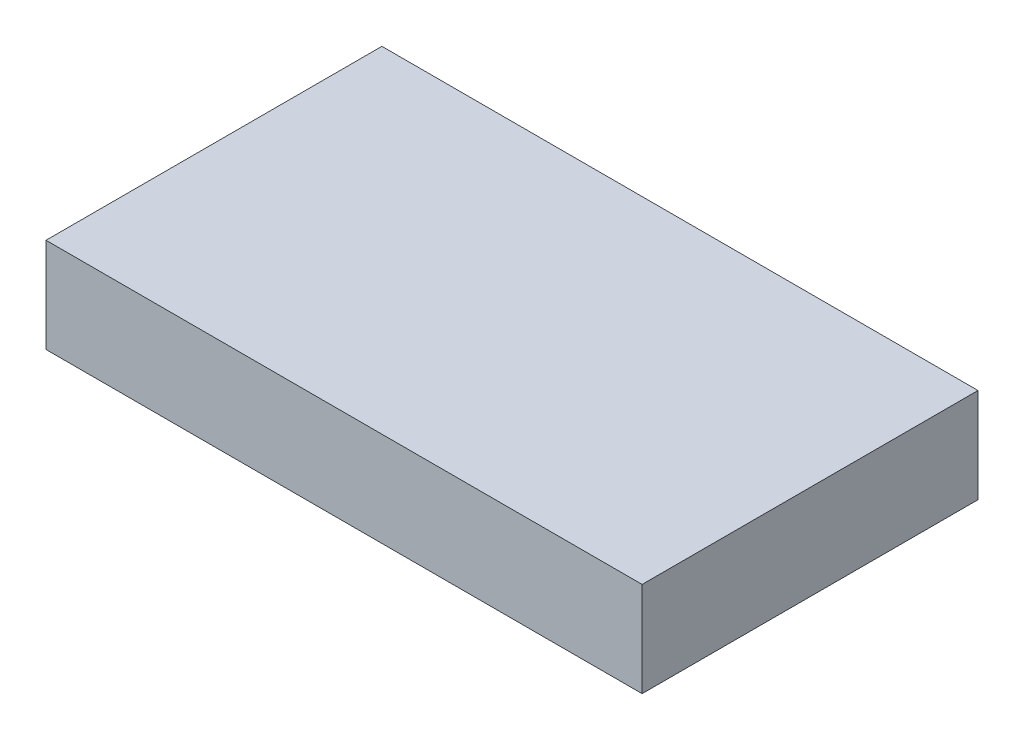
ISO-10303-21;
HEADER;
FILE_DESCRIPTION(('STEP AP214'),'2;1');
FILE_NAME('part.step','',(''),(''),'','','');
FILE_SCHEMA(('AUTOMOTIVE_DESIGN { 1 0 10303 214 1 1 1 1 }'));
ENDSEC;
DATA;
#1=APPLICATION_CONTEXT('core data for automotive mechanical design processes');
#2=APPLICATION_PROTOCOL_DEFINITION('international standard','automotive_design',2000,#1);
#3=PRODUCT_CONTEXT('',#1,'mechanical');
#4=PRODUCT('Part','Part','',(#3));
#5=PRODUCT_RELATED_PRODUCT_CATEGORY('part','',(#4));
#6=PRODUCT_DEFINITION_FORMATION('','',#4);
#7=PRODUCT_DEFINITION_CONTEXT('part definition',#1,'design');
#8=PRODUCT_DEFINITION('design','',#6,#7);
#9=PRODUCT_DEFINITION_SHAPE('','',#8);
#10=(LENGTH_UNIT() NAMED_UNIT(*) SI_UNIT(.MILLI.,.METRE.));
#11=(NAMED_UNIT(*) PLANE_ANGLE_UNIT() SI_UNIT($,.RADIAN.));
#12=(NAMED_UNIT(*) SI_UNIT($,.STERADIAN.) SOLID_ANGLE_UNIT());
#13=UNCERTAINTY_MEASURE_WITH_UNIT(LENGTH_MEASURE(1.E-05),#10,'distance_accuracy_value','');
#14=(GEOMETRIC_REPRESENTATION_CONTEXT(3) GLOBAL_UNCERTAINTY_ASSIGNED_CONTEXT((#13)) GLOBAL_UNIT_ASSIGNED_CONTEXT((#10,
#11,#12)) REPRESENTATION_CONTEXT('',''));
#15=CARTESIAN_POINT('',(0.,0.,0.));
#16=DIRECTION('',(0.,0.,1.));
#17=DIRECTION('',(1.,0.,0.));
#18=AXIS2_PLACEMENT_3D('',#15,#16,#17);
#19=CARTESIAN_POINT('',(63.,20.,35.5));
#20=DIRECTION('',(-1.,0.,0.));
#21=DIRECTION('',(0.,0.,1.));
#22=AXIS2_PLACEMENT_3D('',#19,#20,#21);
#23=PLANE('',#22);
#24=DIRECTION('',(0.,0.,-1.));
#25=VECTOR('',#24,1.);
#26=CARTESIAN_POINT('',(63.,0.,35.5));
#27=LINE('',#26,#25);
#28=CARTESIAN_POINT('',(63.,0.,35.5));
#29=VERTEX_POINT('',#28);
#30=CARTESIAN_POINT('',(63.,0.,-35.5));
#31=VERTEX_POINT('',#30);
#32=EDGE_CURVE('E107',#29,#31,#27,.T.);
#33=ORIENTED_EDGE('',*,*,#32,.T.);
#34=DIRECTION('',(0.,-1.,0.));
#35=VECTOR('',#34,1.);
#36=CARTESIAN_POINT('',(63.,20.,-35.5));
#37=LINE('',#36,#35);
#38=CARTESIAN_POINT('',(63.,20.,-35.5));
#39=VERTEX_POINT('',#38);
#40=EDGE_CURVE('E11',#39,#31,#37,.T.);
#41=ORIENTED_EDGE('',*,*,#40,.F.);
#42=DIRECTION('',(0.,0.,-1.));
#43=VECTOR('',#42,1.);
#44=CARTESIAN_POINT('',(63.,20.,35.5));
#45=LINE('',#44,#43);
#46=CARTESIAN_POINT('',(63.,20.,35.5));
#47=VERTEX_POINT('',#46);
#48=EDGE_CURVE('E91',#47,#39,#45,.T.);
#49=ORIENTED_EDGE('',*,*,#48,.F.);
#50=DIRECTION('',(0.,-1.,0.));
#51=VECTOR('',#50,1.);
#52=CARTESIAN_POINT('',(63.,20.,35.5));
#53=LINE('',#52,#51);
#54=EDGE_CURVE('E103',#47,#29,#53,.T.);
#55=ORIENTED_EDGE('',*,*,#54,.T.);
#56=EDGE_LOOP('',(#33,#41,#49,#55));
#57=FACE_BOUND('',#56,.T.);
#58=ADVANCED_FACE('F39',(#57),#23,.F.);
#59=CARTESIAN_POINT('',(-63.,20.,-35.5));
#60=DIRECTION('',(0.,0.,1.));
#61=DIRECTION('',(1.,0.,0.));
#62=AXIS2_PLACEMENT_3D('',#59,#60,#61);
#63=PLANE('',#62);
#64=DIRECTION('',(-1.,0.,0.));
#65=VECTOR('',#64,1.);
#66=CARTESIAN_POINT('',(-63.,0.,-35.5));
#67=LINE('',#66,#65);
#68=CARTESIAN_POINT('',(-63.,0.,-35.5));
#69=VERTEX_POINT('',#68);
#70=EDGE_CURVE('E96',#31,#69,#67,.T.);
#71=ORIENTED_EDGE('',*,*,#70,.T.);
#72=DIRECTION('',(0.,-1.,0.));
#73=VECTOR('',#72,1.);
#74=CARTESIAN_POINT('',(-63.,20.,-35.5));
#75=LINE('',#74,#73);
#76=CARTESIAN_POINT('',(-63.,20.,-35.5));
#77=VERTEX_POINT('',#76);
#78=EDGE_CURVE('E48',#77,#69,#75,.T.);
#79=ORIENTED_EDGE('',*,*,#78,.F.);
#80=DIRECTION('',(-1.,0.,0.));
#81=VECTOR('',#80,1.);
#82=CARTESIAN_POINT('',(-63.,20.,-35.5));
#83=LINE('',#82,#81);
#84=EDGE_CURVE('E86',#39,#77,#83,.T.);
#85=ORIENTED_EDGE('',*,*,#84,.F.);
#86=ORIENTED_EDGE('',*,*,#40,.T.);
#87=EDGE_LOOP('',(#71,#79,#85,#86));
#88=FACE_BOUND('',#87,.T.);
#89=ADVANCED_FACE('F95',(#88),#63,.F.);
#90=CARTESIAN_POINT('',(-63.,20.,35.5));
#91=DIRECTION('',(1.,0.,0.));
#92=DIRECTION('',(0.,0.,-1.));
#93=AXIS2_PLACEMENT_3D('',#90,#91,#92);
#94=PLANE('',#93);
#95=DIRECTION('',(0.,0.,1.));
#96=VECTOR('',#95,1.);
#97=CARTESIAN_POINT('',(-63.,0.,35.5));
#98=LINE('',#97,#96);
#99=CARTESIAN_POINT('',(-63.,0.,35.5));
#100=VERTEX_POINT('',#99);
#101=EDGE_CURVE('E73',#69,#100,#98,.T.);
#102=ORIENTED_EDGE('',*,*,#101,.T.);
#103=DIRECTION('',(0.,-1.,0.));
#104=VECTOR('',#103,1.);
#105=CARTESIAN_POINT('',(-63.,20.,35.5));
#106=LINE('',#105,#104);
#107=CARTESIAN_POINT('',(-63.,20.,35.5));
#108=VERTEX_POINT('',#107);
#109=EDGE_CURVE('E98',#108,#100,#106,.T.);
#110=ORIENTED_EDGE('',*,*,#109,.F.);
#111=DIRECTION('',(0.,0.,1.));
#112=VECTOR('',#111,1.);
#113=CARTESIAN_POINT('',(-63.,20.,35.5));
#114=LINE('',#113,#112);
#115=EDGE_CURVE('E89',#77,#108,#114,.T.);
#116=ORIENTED_EDGE('',*,*,#115,.F.);
#117=ORIENTED_EDGE('',*,*,#78,.T.);
#118=EDGE_LOOP('',(#102,#110,#116,#117));
#119=FACE_BOUND('',#118,.T.);
#120=ADVANCED_FACE('F99',(#119),#94,.F.);
#121=CARTESIAN_POINT('',(-63.,20.,35.5));
#122=DIRECTION('',(0.,0.,-1.));
#123=DIRECTION('',(-1.,0.,0.));
#124=AXIS2_PLACEMENT_3D('',#121,#122,#123);
#125=PLANE('',#124);
#126=DIRECTION('',(1.,0.,0.));
#127=VECTOR('',#126,1.);
#128=CARTESIAN_POINT('',(-63.,0.,35.5));
#129=LINE('',#128,#127);
#130=EDGE_CURVE('E79',#100,#29,#129,.T.);
#131=ORIENTED_EDGE('',*,*,#130,.T.);
#132=ORIENTED_EDGE('',*,*,#54,.F.);
#133=DIRECTION('',(1.,0.,0.));
#134=VECTOR('',#133,1.);
#135=CARTESIAN_POINT('',(-63.,20.,35.5));
#136=LINE('',#135,#134);
#137=EDGE_CURVE('E56',#108,#47,#136,.T.);
#138=ORIENTED_EDGE('',*,*,#137,.F.);
#139=ORIENTED_EDGE('',*,*,#109,.T.);
#140=EDGE_LOOP('',(#131,#132,#138,#139));
#141=FACE_BOUND('',#140,.T.);
#142=ADVANCED_FACE('F120',(#141),#125,.F.);
#143=CARTESIAN_POINT('',(0.,20.,0.));
#144=DIRECTION('',(0.,-1.,0.));
#145=DIRECTION('',(0.,0.,-1.));
#146=AXIS2_PLACEMENT_3D('',#143,#144,#145);
#147=PLANE('',#146);
#148=ORIENTED_EDGE('',*,*,#48,.T.);
#149=ORIENTED_EDGE('',*,*,#84,.T.);
#150=ORIENTED_EDGE('',*,*,#115,.T.);
#151=ORIENTED_EDGE('',*,*,#137,.T.);
#152=EDGE_LOOP('',(#148,#149,#150,#151));
#153=FACE_BOUND('',#152,.T.);
#154=ADVANCED_FACE('F87',(#153),#147,.F.);
#155=CARTESIAN_POINT('',(0.,0.,0.));
#156=DIRECTION('',(0.,-1.,0.));
#157=DIRECTION('',(0.,0.,-1.));
#158=AXIS2_PLACEMENT_3D('',#155,#156,#157);
#159=PLANE('',#158);
#160=ORIENTED_EDGE('',*,*,#32,.F.);
#161=ORIENTED_EDGE('',*,*,#130,.F.);
#162=ORIENTED_EDGE('',*,*,#101,.F.);
#163=ORIENTED_EDGE('',*,*,#70,.F.);
#164=EDGE_LOOP('',(#160,#161,#162,#163));
#165=FACE_BOUND('',#164,.T.);
#166=ADVANCED_FACE('F123',(#165),#159,.T.);
#167=CLOSED_SHELL('',(#58,#89,#120,#142,#154,#166));
#168=MANIFOLD_SOLID_BREP('B2',#167);
#169=ADVANCED_BREP_SHAPE_REPRESENTATION('',(#18,#168),#14);
#170=SHAPE_DEFINITION_REPRESENTATION(#9,#169);
ENDSEC;
END-ISO-10303-21;
